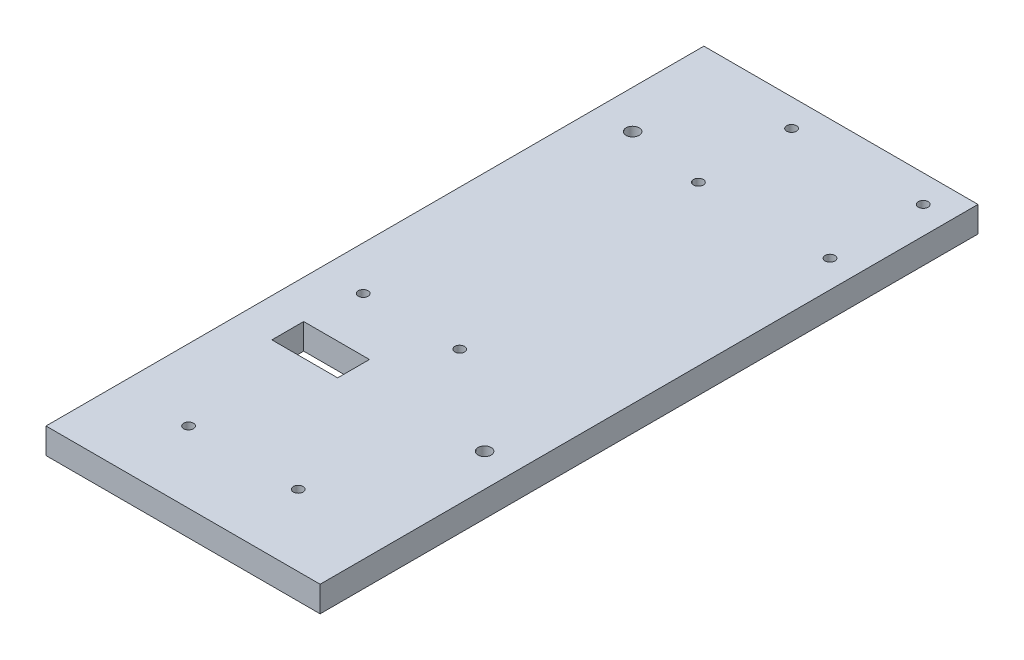
ISO-10303-21;
HEADER;
FILE_DESCRIPTION(('STEP AP214'),'2;1');
FILE_NAME('part.step','',(''),(''),'','','');
FILE_SCHEMA(('AUTOMOTIVE_DESIGN { 1 0 10303 214 1 1 1 1 }'));
ENDSEC;
DATA;
#1=APPLICATION_CONTEXT('core data for automotive mechanical design processes');
#2=APPLICATION_PROTOCOL_DEFINITION('international standard','automotive_design',2000,#1);
#3=PRODUCT_CONTEXT('',#1,'mechanical');
#4=PRODUCT('Part','Part','',(#3));
#5=PRODUCT_RELATED_PRODUCT_CATEGORY('part','',(#4));
#6=PRODUCT_DEFINITION_FORMATION('','',#4);
#7=PRODUCT_DEFINITION_CONTEXT('part definition',#1,'design');
#8=PRODUCT_DEFINITION('design','',#6,#7);
#9=PRODUCT_DEFINITION_SHAPE('','',#8);
#10=(LENGTH_UNIT() NAMED_UNIT(*) SI_UNIT(.MILLI.,.METRE.));
#11=(NAMED_UNIT(*) PLANE_ANGLE_UNIT() SI_UNIT($,.RADIAN.));
#12=(NAMED_UNIT(*) SI_UNIT($,.STERADIAN.) SOLID_ANGLE_UNIT());
#13=UNCERTAINTY_MEASURE_WITH_UNIT(LENGTH_MEASURE(1.E-05),#10,'distance_accuracy_value','');
#14=(GEOMETRIC_REPRESENTATION_CONTEXT(3) GLOBAL_UNCERTAINTY_ASSIGNED_CONTEXT((#13)) GLOBAL_UNIT_ASSIGNED_CONTEXT((#10,
#11,#12)) REPRESENTATION_CONTEXT('',''));
#15=CARTESIAN_POINT('',(0.,0.,0.));
#16=DIRECTION('',(0.,0.,1.));
#17=DIRECTION('',(1.,0.,0.));
#18=AXIS2_PLACEMENT_3D('',#15,#16,#17);
#19=CARTESIAN_POINT('',(0.,5.9436,0.));
#20=DIRECTION('',(1.,0.,0.));
#21=DIRECTION('',(0.,0.,-1.));
#22=AXIS2_PLACEMENT_3D('',#19,#20,#21);
#23=PLANE('',#22);
#24=DIRECTION('',(0.,0.,1.));
#25=VECTOR('',#24,1.);
#26=CARTESIAN_POINT('',(0.,0.,0.));
#27=LINE('',#26,#25);
#28=CARTESIAN_POINT('',(0.,0.,-152.4));
#29=VERTEX_POINT('',#28);
#30=CARTESIAN_POINT('',(0.,0.,0.));
#31=VERTEX_POINT('',#30);
#32=EDGE_CURVE('E149',#29,#31,#27,.T.);
#33=ORIENTED_EDGE('',*,*,#32,.T.);
#34=DIRECTION('',(0.,-1.,0.));
#35=VECTOR('',#34,1.);
#36=CARTESIAN_POINT('',(0.,5.9436,0.));
#37=LINE('',#36,#35);
#38=CARTESIAN_POINT('',(0.,5.9436,0.));
#39=VERTEX_POINT('',#38);
#40=EDGE_CURVE('E11',#39,#31,#37,.T.);
#41=ORIENTED_EDGE('',*,*,#40,.F.);
#42=DIRECTION('',(0.,0.,1.));
#43=VECTOR('',#42,1.);
#44=CARTESIAN_POINT('',(0.,5.9436,0.));
#45=LINE('',#44,#43);
#46=CARTESIAN_POINT('',(0.,5.9436,-152.4));
#47=VERTEX_POINT('',#46);
#48=EDGE_CURVE('E155',#47,#39,#45,.T.);
#49=ORIENTED_EDGE('',*,*,#48,.F.);
#50=DIRECTION('',(0.,-1.,0.));
#51=VECTOR('',#50,1.);
#52=CARTESIAN_POINT('',(0.,5.9436,-152.4));
#53=LINE('',#52,#51);
#54=EDGE_CURVE('E169',#47,#29,#53,.T.);
#55=ORIENTED_EDGE('',*,*,#54,.T.);
#56=EDGE_LOOP('',(#33,#41,#49,#55));
#57=FACE_BOUND('',#56,.T.);
#58=ADVANCED_FACE('F38',(#57),#23,.F.);
#59=CARTESIAN_POINT('',(0.,5.9436,0.));
#60=DIRECTION('',(0.,0.,-1.));
#61=DIRECTION('',(-1.,0.,0.));
#62=AXIS2_PLACEMENT_3D('',#59,#60,#61);
#63=PLANE('',#62);
#64=DIRECTION('',(1.,0.,0.));
#65=VECTOR('',#64,1.);
#66=CARTESIAN_POINT('',(0.,0.,0.));
#67=LINE('',#66,#65);
#68=CARTESIAN_POINT('',(63.5,0.,0.));
#69=VERTEX_POINT('',#68);
#70=EDGE_CURVE('E173',#31,#69,#67,.T.);
#71=ORIENTED_EDGE('',*,*,#70,.T.);
#72=DIRECTION('',(0.,-1.,0.));
#73=VECTOR('',#72,1.);
#74=CARTESIAN_POINT('',(63.5,5.9436,0.));
#75=LINE('',#74,#73);
#76=CARTESIAN_POINT('',(63.5,5.9436,0.));
#77=VERTEX_POINT('',#76);
#78=EDGE_CURVE('E46',#77,#69,#75,.T.);
#79=ORIENTED_EDGE('',*,*,#78,.F.);
#80=DIRECTION('',(1.,0.,0.));
#81=VECTOR('',#80,1.);
#82=CARTESIAN_POINT('',(0.,5.9436,0.));
#83=LINE('',#82,#81);
#84=EDGE_CURVE('E159',#39,#77,#83,.T.);
#85=ORIENTED_EDGE('',*,*,#84,.F.);
#86=ORIENTED_EDGE('',*,*,#40,.T.);
#87=EDGE_LOOP('',(#71,#79,#85,#86));
#88=FACE_BOUND('',#87,.T.);
#89=ADVANCED_FACE('F207',(#88),#63,.F.);
#90=CARTESIAN_POINT('',(63.5,5.9436,0.));
#91=DIRECTION('',(-1.,0.,0.));
#92=DIRECTION('',(0.,0.,1.));
#93=AXIS2_PLACEMENT_3D('',#90,#91,#92);
#94=PLANE('',#93);
#95=DIRECTION('',(0.,0.,-1.));
#96=VECTOR('',#95,1.);
#97=CARTESIAN_POINT('',(63.5,0.,0.));
#98=LINE('',#97,#96);
#99=CARTESIAN_POINT('',(63.5,0.,-152.4));
#100=VERTEX_POINT('',#99);
#101=EDGE_CURVE('E176',#69,#100,#98,.T.);
#102=ORIENTED_EDGE('',*,*,#101,.T.);
#103=DIRECTION('',(0.,-1.,0.));
#104=VECTOR('',#103,1.);
#105=CARTESIAN_POINT('',(63.5,5.9436,-152.4));
#106=LINE('',#105,#104);
#107=CARTESIAN_POINT('',(63.5,5.9436,-152.4));
#108=VERTEX_POINT('',#107);
#109=EDGE_CURVE('E184',#108,#100,#106,.T.);
#110=ORIENTED_EDGE('',*,*,#109,.F.);
#111=DIRECTION('',(0.,0.,-1.));
#112=VECTOR('',#111,1.);
#113=CARTESIAN_POINT('',(63.5,5.9436,0.));
#114=LINE('',#113,#112);
#115=EDGE_CURVE('E163',#77,#108,#114,.T.);
#116=ORIENTED_EDGE('',*,*,#115,.F.);
#117=ORIENTED_EDGE('',*,*,#78,.T.);
#118=EDGE_LOOP('',(#102,#110,#116,#117));
#119=FACE_BOUND('',#118,.T.);
#120=ADVANCED_FACE('F193',(#119),#94,.F.);
#121=CARTESIAN_POINT('',(0.,5.9436,-152.4));
#122=DIRECTION('',(0.,0.,1.));
#123=DIRECTION('',(1.,0.,0.));
#124=AXIS2_PLACEMENT_3D('',#121,#122,#123);
#125=PLANE('',#124);
#126=DIRECTION('',(-1.,0.,0.));
#127=VECTOR('',#126,1.);
#128=CARTESIAN_POINT('',(0.,0.,-152.4));
#129=LINE('',#128,#127);
#130=EDGE_CURVE('E160',#100,#29,#129,.T.);
#131=ORIENTED_EDGE('',*,*,#130,.T.);
#132=ORIENTED_EDGE('',*,*,#54,.F.);
#133=DIRECTION('',(-1.,0.,0.));
#134=VECTOR('',#133,1.);
#135=CARTESIAN_POINT('',(0.,5.9436,-152.4));
#136=LINE('',#135,#134);
#137=EDGE_CURVE('E166',#108,#47,#136,.T.);
#138=ORIENTED_EDGE('',*,*,#137,.F.);
#139=ORIENTED_EDGE('',*,*,#109,.T.);
#140=EDGE_LOOP('',(#131,#132,#138,#139));
#141=FACE_BOUND('',#140,.T.);
#142=ADVANCED_FACE('F200',(#141),#125,.F.);
#143=CARTESIAN_POINT('',(0.,5.9436,0.));
#144=DIRECTION('',(0.,-1.,0.));
#145=DIRECTION('',(0.,0.,-1.));
#146=AXIS2_PLACEMENT_3D('',#143,#144,#145);
#147=PLANE('',#146);
#148=CARTESIAN_POINT('',(8.88999999999999,5.9436,-127.));
#149=DIRECTION('',(0.,1.,0.));
#150=DIRECTION('',(0.,0.,1.));
#151=AXIS2_PLACEMENT_3D('',#148,#149,#150);
#152=CIRCLE('',#151,1.524);
#153=CARTESIAN_POINT('',(8.88999999999999,5.9436,-125.476));
#154=VERTEX_POINT('',#153);
#155=EDGE_CURVE('E281',#154,#154,#152,.T.);
#156=ORIENTED_EDGE('',*,*,#155,.F.);
#157=EDGE_LOOP('',(#156));
#158=FACE_BOUND('',#157,.T.);
#159=CARTESIAN_POINT('',(55.88,5.9436,-45.72));
#160=DIRECTION('',(0.,1.,0.));
#161=DIRECTION('',(0.,0.,1.));
#162=AXIS2_PLACEMENT_3D('',#159,#160,#161);
#163=CIRCLE('',#162,1.524);
#164=CARTESIAN_POINT('',(55.88,5.9436,-44.196));
#165=VERTEX_POINT('',#164);
#166=EDGE_CURVE('E290',#165,#165,#163,.T.);
#167=ORIENTED_EDGE('',*,*,#166,.F.);
#168=EDGE_LOOP('',(#167));
#169=FACE_BOUND('',#168,.T.);
#170=CARTESIAN_POINT('',(41.91,5.9436,-16.51));
#171=DIRECTION('',(0.,1.,0.));
#172=DIRECTION('',(0.,0.,1.));
#173=AXIS2_PLACEMENT_3D('',#170,#171,#172);
#174=CIRCLE('',#173,1.13029999999999);
#175=CARTESIAN_POINT('',(41.91,5.9436,-15.3797));
#176=VERTEX_POINT('',#175);
#177=EDGE_CURVE('E287',#176,#176,#174,.T.);
#178=ORIENTED_EDGE('',*,*,#177,.F.);
#179=EDGE_LOOP('',(#178));
#180=FACE_BOUND('',#179,.T.);
#181=CARTESIAN_POINT('',(16.51,5.9436,-16.51));
#182=DIRECTION('',(0.,1.,0.));
#183=DIRECTION('',(0.,0.,1.));
#184=AXIS2_PLACEMENT_3D('',#181,#182,#183);
#185=CIRCLE('',#184,1.13029999999999);
#186=CARTESIAN_POINT('',(16.51,5.9436,-15.3797));
#187=VERTEX_POINT('',#186);
#188=EDGE_CURVE('E303',#187,#187,#185,.T.);
#189=ORIENTED_EDGE('',*,*,#188,.F.);
#190=EDGE_LOOP('',(#189));
#191=FACE_BOUND('',#190,.T.);
#192=CARTESIAN_POINT('',(32.512,5.9436,-63.3222));
#193=DIRECTION('',(0.,1.,0.));
#194=DIRECTION('',(0.,0.,1.));
#195=AXIS2_PLACEMENT_3D('',#192,#193,#194);
#196=CIRCLE('',#195,1.13029999999999);
#197=CARTESIAN_POINT('',(32.512,5.9436,-62.1919));
#198=VERTEX_POINT('',#197);
#199=EDGE_CURVE('E311',#198,#198,#196,.T.);
#200=ORIENTED_EDGE('',*,*,#199,.F.);
#201=EDGE_LOOP('',(#200));
#202=FACE_BOUND('',#201,.T.);
#203=CARTESIAN_POINT('',(10.16,5.9436,-63.3222));
#204=DIRECTION('',(0.,1.,0.));
#205=DIRECTION('',(0.,0.,1.));
#206=AXIS2_PLACEMENT_3D('',#203,#204,#205);
#207=CIRCLE('',#206,1.13029999999999);
#208=CARTESIAN_POINT('',(10.16,5.9436,-62.1919));
#209=VERTEX_POINT('',#208);
#210=EDGE_CURVE('E319',#209,#209,#207,.T.);
#211=ORIENTED_EDGE('',*,*,#210,.F.);
#212=EDGE_LOOP('',(#211));
#213=FACE_BOUND('',#212,.T.);
#214=CARTESIAN_POINT('',(57.15,5.9436,-146.05));
#215=DIRECTION('',(0.,1.,0.));
#216=DIRECTION('',(0.,0.,1.));
#217=AXIS2_PLACEMENT_3D('',#214,#215,#216);
#218=CIRCLE('',#217,1.13029999999999);
#219=CARTESIAN_POINT('',(57.15,5.9436,-144.9197));
#220=VERTEX_POINT('',#219);
#221=EDGE_CURVE('E327',#220,#220,#218,.T.);
#222=ORIENTED_EDGE('',*,*,#221,.F.);
#223=EDGE_LOOP('',(#222));
#224=FACE_BOUND('',#223,.T.);
#225=CARTESIAN_POINT('',(57.15,5.9436,-124.46));
#226=DIRECTION('',(0.,1.,0.));
#227=DIRECTION('',(0.,0.,1.));
#228=AXIS2_PLACEMENT_3D('',#225,#226,#227);
#229=CIRCLE('',#228,1.13029999999999);
#230=CARTESIAN_POINT('',(57.15,5.9436,-123.3297));
#231=VERTEX_POINT('',#230);
#232=EDGE_CURVE('E335',#231,#231,#229,.T.);
#233=ORIENTED_EDGE('',*,*,#232,.F.);
#234=EDGE_LOOP('',(#233));
#235=FACE_BOUND('',#234,.T.);
#236=CARTESIAN_POINT('',(26.67,5.9436,-124.46));
#237=DIRECTION('',(0.,1.,0.));
#238=DIRECTION('',(0.,0.,1.));
#239=AXIS2_PLACEMENT_3D('',#236,#237,#238);
#240=CIRCLE('',#239,1.13029999999999);
#241=CARTESIAN_POINT('',(26.67,5.9436,-123.3297));
#242=VERTEX_POINT('',#241);
#243=EDGE_CURVE('E343',#242,#242,#240,.T.);
#244=ORIENTED_EDGE('',*,*,#243,.F.);
#245=EDGE_LOOP('',(#244));
#246=FACE_BOUND('',#245,.T.);
#247=CARTESIAN_POINT('',(26.67,5.9436,-146.05));
#248=DIRECTION('',(0.,1.,0.));
#249=DIRECTION('',(0.,0.,1.));
#250=AXIS2_PLACEMENT_3D('',#247,#248,#249);
#251=CIRCLE('',#250,1.13029999999999);
#252=CARTESIAN_POINT('',(26.67,5.9436,-144.9197));
#253=VERTEX_POINT('',#252);
#254=EDGE_CURVE('E350',#253,#253,#251,.T.);
#255=ORIENTED_EDGE('',*,*,#254,.F.);
#256=EDGE_LOOP('',(#255));
#257=FACE_BOUND('',#256,.T.);
#258=DIRECTION('',(-1.,0.,0.));
#259=VECTOR('',#258,1.);
#260=CARTESIAN_POINT('',(8.89,5.9436,-50.8));
#261=LINE('',#260,#259);
#262=CARTESIAN_POINT('',(24.13,5.9436,-50.8));
#263=VERTEX_POINT('',#262);
#264=CARTESIAN_POINT('',(8.89,5.9436,-50.8));
#265=VERTEX_POINT('',#264);
#266=EDGE_CURVE('E140',#263,#265,#261,.T.);
#267=ORIENTED_EDGE('',*,*,#266,.F.);
#268=DIRECTION('',(0.,0.,-1.));
#269=VECTOR('',#268,1.);
#270=CARTESIAN_POINT('',(24.13,5.9436,-50.8));
#271=LINE('',#270,#269);
#272=CARTESIAN_POINT('',(24.13,5.9436,-43.434));
#273=VERTEX_POINT('',#272);
#274=EDGE_CURVE('E53',#273,#263,#271,.T.);
#275=ORIENTED_EDGE('',*,*,#274,.F.);
#276=DIRECTION('',(1.,0.,0.));
#277=VECTOR('',#276,1.);
#278=CARTESIAN_POINT('',(8.89,5.9436,-43.434));
#279=LINE('',#278,#277);
#280=CARTESIAN_POINT('',(8.89,5.9436,-43.434));
#281=VERTEX_POINT('',#280);
#282=EDGE_CURVE('E124',#281,#273,#279,.T.);
#283=ORIENTED_EDGE('',*,*,#282,.F.);
#284=DIRECTION('',(0.,0.,1.));
#285=VECTOR('',#284,1.);
#286=CARTESIAN_POINT('',(8.89,5.9436,-50.8));
#287=LINE('',#286,#285);
#288=EDGE_CURVE('E128',#265,#281,#287,.T.);
#289=ORIENTED_EDGE('',*,*,#288,.F.);
#290=EDGE_LOOP('',(#267,#275,#283,#289));
#291=FACE_BOUND('',#290,.T.);
#292=ORIENTED_EDGE('',*,*,#48,.T.);
#293=ORIENTED_EDGE('',*,*,#84,.T.);
#294=ORIENTED_EDGE('',*,*,#115,.T.);
#295=ORIENTED_EDGE('',*,*,#137,.T.);
#296=EDGE_LOOP('',(#292,#293,#294,#295));
#297=FACE_BOUND('',#296,.T.);
#298=ADVANCED_FACE('F206',(#158,#169,#180,#191,#202,#213,#224,#235,#246,#257,#291,#297),#147,.F.);
#299=CARTESIAN_POINT('',(0.,0.,0.));
#300=DIRECTION('',(0.,-1.,0.));
#301=DIRECTION('',(0.,0.,-1.));
#302=AXIS2_PLACEMENT_3D('',#299,#300,#301);
#303=PLANE('',#302);
#304=CARTESIAN_POINT('',(8.88999999999999,0.,-127.));
#305=DIRECTION('',(0.,1.,0.));
#306=DIRECTION('',(0.,0.,1.));
#307=AXIS2_PLACEMENT_3D('',#304,#305,#306);
#308=CIRCLE('',#307,1.524);
#309=CARTESIAN_POINT('',(8.88999999999999,0.,-125.476));
#310=VERTEX_POINT('',#309);
#311=EDGE_CURVE('E278',#310,#310,#308,.T.);
#312=ORIENTED_EDGE('',*,*,#311,.T.);
#313=EDGE_LOOP('',(#312));
#314=FACE_BOUND('',#313,.T.);
#315=CARTESIAN_POINT('',(55.88,0.,-45.72));
#316=DIRECTION('',(0.,1.,0.));
#317=DIRECTION('',(0.,0.,1.));
#318=AXIS2_PLACEMENT_3D('',#315,#316,#317);
#319=CIRCLE('',#318,1.524);
#320=CARTESIAN_POINT('',(55.88,0.,-44.196));
#321=VERTEX_POINT('',#320);
#322=EDGE_CURVE('E283',#321,#321,#319,.T.);
#323=ORIENTED_EDGE('',*,*,#322,.T.);
#324=EDGE_LOOP('',(#323));
#325=FACE_BOUND('',#324,.T.);
#326=CARTESIAN_POINT('',(41.91,0.,-16.51));
#327=DIRECTION('',(0.,1.,0.));
#328=DIRECTION('',(0.,0.,1.));
#329=AXIS2_PLACEMENT_3D('',#326,#327,#328);
#330=CIRCLE('',#329,1.1303);
#331=CARTESIAN_POINT('',(41.91,0.,-15.3797));
#332=VERTEX_POINT('',#331);
#333=EDGE_CURVE('E299',#332,#332,#330,.T.);
#334=ORIENTED_EDGE('',*,*,#333,.T.);
#335=EDGE_LOOP('',(#334));
#336=FACE_BOUND('',#335,.T.);
#337=CARTESIAN_POINT('',(16.51,0.,-16.51));
#338=DIRECTION('',(0.,1.,0.));
#339=DIRECTION('',(0.,0.,1.));
#340=AXIS2_PLACEMENT_3D('',#337,#338,#339);
#341=CIRCLE('',#340,1.1303);
#342=CARTESIAN_POINT('',(16.51,0.,-15.3797));
#343=VERTEX_POINT('',#342);
#344=EDGE_CURVE('E307',#343,#343,#341,.T.);
#345=ORIENTED_EDGE('',*,*,#344,.T.);
#346=EDGE_LOOP('',(#345));
#347=FACE_BOUND('',#346,.T.);
#348=CARTESIAN_POINT('',(32.512,0.,-63.3222));
#349=DIRECTION('',(0.,1.,0.));
#350=DIRECTION('',(0.,0.,1.));
#351=AXIS2_PLACEMENT_3D('',#348,#349,#350);
#352=CIRCLE('',#351,1.1303);
#353=CARTESIAN_POINT('',(32.512,0.,-62.1919));
#354=VERTEX_POINT('',#353);
#355=EDGE_CURVE('E315',#354,#354,#352,.T.);
#356=ORIENTED_EDGE('',*,*,#355,.T.);
#357=EDGE_LOOP('',(#356));
#358=FACE_BOUND('',#357,.T.);
#359=CARTESIAN_POINT('',(10.16,0.,-63.3222));
#360=DIRECTION('',(0.,1.,0.));
#361=DIRECTION('',(0.,0.,1.));
#362=AXIS2_PLACEMENT_3D('',#359,#360,#361);
#363=CIRCLE('',#362,1.1303);
#364=CARTESIAN_POINT('',(10.16,0.,-62.1919));
#365=VERTEX_POINT('',#364);
#366=EDGE_CURVE('E323',#365,#365,#363,.T.);
#367=ORIENTED_EDGE('',*,*,#366,.T.);
#368=EDGE_LOOP('',(#367));
#369=FACE_BOUND('',#368,.T.);
#370=CARTESIAN_POINT('',(57.15,0.,-146.05));
#371=DIRECTION('',(0.,1.,0.));
#372=DIRECTION('',(0.,0.,1.));
#373=AXIS2_PLACEMENT_3D('',#370,#371,#372);
#374=CIRCLE('',#373,1.1303);
#375=CARTESIAN_POINT('',(57.15,0.,-144.9197));
#376=VERTEX_POINT('',#375);
#377=EDGE_CURVE('E331',#376,#376,#374,.T.);
#378=ORIENTED_EDGE('',*,*,#377,.T.);
#379=EDGE_LOOP('',(#378));
#380=FACE_BOUND('',#379,.T.);
#381=CARTESIAN_POINT('',(57.15,0.,-124.46));
#382=DIRECTION('',(0.,1.,0.));
#383=DIRECTION('',(0.,0.,1.));
#384=AXIS2_PLACEMENT_3D('',#381,#382,#383);
#385=CIRCLE('',#384,1.1303);
#386=CARTESIAN_POINT('',(57.15,0.,-123.3297));
#387=VERTEX_POINT('',#386);
#388=EDGE_CURVE('E339',#387,#387,#385,.T.);
#389=ORIENTED_EDGE('',*,*,#388,.T.);
#390=EDGE_LOOP('',(#389));
#391=FACE_BOUND('',#390,.T.);
#392=CARTESIAN_POINT('',(26.67,0.,-124.46));
#393=DIRECTION('',(0.,1.,0.));
#394=DIRECTION('',(0.,0.,1.));
#395=AXIS2_PLACEMENT_3D('',#392,#393,#394);
#396=CIRCLE('',#395,1.1303);
#397=CARTESIAN_POINT('',(26.67,0.,-123.3297));
#398=VERTEX_POINT('',#397);
#399=EDGE_CURVE('E347',#398,#398,#396,.T.);
#400=ORIENTED_EDGE('',*,*,#399,.T.);
#401=EDGE_LOOP('',(#400));
#402=FACE_BOUND('',#401,.T.);
#403=CARTESIAN_POINT('',(26.67,0.,-146.05));
#404=DIRECTION('',(0.,1.,0.));
#405=DIRECTION('',(0.,0.,1.));
#406=AXIS2_PLACEMENT_3D('',#403,#404,#405);
#407=CIRCLE('',#406,1.1303);
#408=CARTESIAN_POINT('',(26.67,0.,-144.9197));
#409=VERTEX_POINT('',#408);
#410=EDGE_CURVE('E131',#409,#409,#407,.T.);
#411=ORIENTED_EDGE('',*,*,#410,.T.);
#412=EDGE_LOOP('',(#411));
#413=FACE_BOUND('',#412,.T.);
#414=DIRECTION('',(0.,0.,-1.));
#415=VECTOR('',#414,1.);
#416=CARTESIAN_POINT('',(24.13,0.,-50.8));
#417=LINE('',#416,#415);
#418=CARTESIAN_POINT('',(24.13,0.,-43.434));
#419=VERTEX_POINT('',#418);
#420=CARTESIAN_POINT('',(24.13,0.,-50.8));
#421=VERTEX_POINT('',#420);
#422=EDGE_CURVE('E105',#419,#421,#417,.T.);
#423=ORIENTED_EDGE('',*,*,#422,.T.);
#424=DIRECTION('',(-1.,0.,0.));
#425=VECTOR('',#424,1.);
#426=CARTESIAN_POINT('',(8.89,0.,-50.8));
#427=LINE('',#426,#425);
#428=CARTESIAN_POINT('',(8.89,0.,-50.8));
#429=VERTEX_POINT('',#428);
#430=EDGE_CURVE('E115',#421,#429,#427,.T.);
#431=ORIENTED_EDGE('',*,*,#430,.T.);
#432=DIRECTION('',(0.,0.,1.));
#433=VECTOR('',#432,1.);
#434=CARTESIAN_POINT('',(8.89,0.,-50.8));
#435=LINE('',#434,#433);
#436=CARTESIAN_POINT('',(8.89,0.,-43.434));
#437=VERTEX_POINT('',#436);
#438=EDGE_CURVE('E61',#429,#437,#435,.T.);
#439=ORIENTED_EDGE('',*,*,#438,.T.);
#440=DIRECTION('',(1.,0.,0.));
#441=VECTOR('',#440,1.);
#442=CARTESIAN_POINT('',(8.89,0.,-43.434));
#443=LINE('',#442,#441);
#444=EDGE_CURVE('E112',#437,#419,#443,.T.);
#445=ORIENTED_EDGE('',*,*,#444,.T.);
#446=EDGE_LOOP('',(#423,#431,#439,#445));
#447=FACE_BOUND('',#446,.T.);
#448=ORIENTED_EDGE('',*,*,#32,.F.);
#449=ORIENTED_EDGE('',*,*,#130,.F.);
#450=ORIENTED_EDGE('',*,*,#101,.F.);
#451=ORIENTED_EDGE('',*,*,#70,.F.);
#452=EDGE_LOOP('',(#448,#449,#450,#451));
#453=FACE_BOUND('',#452,.T.);
#454=ADVANCED_FACE('F120',(#314,#325,#336,#347,#358,#369,#380,#391,#402,#413,#447,#453),#303,.T.);
#455=CARTESIAN_POINT('',(24.13,0.,-50.8));
#456=DIRECTION('',(1.,0.,0.));
#457=DIRECTION('',(0.,0.,-1.));
#458=AXIS2_PLACEMENT_3D('',#455,#456,#457);
#459=PLANE('',#458);
#460=ORIENTED_EDGE('',*,*,#274,.T.);
#461=DIRECTION('',(0.,1.,0.));
#462=VECTOR('',#461,1.);
#463=CARTESIAN_POINT('',(24.13,0.,-50.8));
#464=LINE('',#463,#462);
#465=EDGE_CURVE('E101',#421,#263,#464,.T.);
#466=ORIENTED_EDGE('',*,*,#465,.F.);
#467=ORIENTED_EDGE('',*,*,#422,.F.);
#468=DIRECTION('',(0.,1.,0.));
#469=VECTOR('',#468,1.);
#470=CARTESIAN_POINT('',(24.13,0.,-43.434));
#471=LINE('',#470,#469);
#472=EDGE_CURVE('E146',#419,#273,#471,.T.);
#473=ORIENTED_EDGE('',*,*,#472,.T.);
#474=EDGE_LOOP('',(#460,#466,#467,#473));
#475=FACE_BOUND('',#474,.T.);
#476=ADVANCED_FACE('F103',(#475),#459,.F.);
#477=CARTESIAN_POINT('',(8.89,0.,-43.434));
#478=DIRECTION('',(0.,0.,1.));
#479=DIRECTION('',(1.,0.,0.));
#480=AXIS2_PLACEMENT_3D('',#477,#478,#479);
#481=PLANE('',#480);
#482=ORIENTED_EDGE('',*,*,#282,.T.);
#483=ORIENTED_EDGE('',*,*,#472,.F.);
#484=ORIENTED_EDGE('',*,*,#444,.F.);
#485=DIRECTION('',(0.,1.,0.));
#486=VECTOR('',#485,1.);
#487=CARTESIAN_POINT('',(8.89,0.,-43.434));
#488=LINE('',#487,#486);
#489=EDGE_CURVE('E150',#437,#281,#488,.T.);
#490=ORIENTED_EDGE('',*,*,#489,.T.);
#491=EDGE_LOOP('',(#482,#483,#484,#490));
#492=FACE_BOUND('',#491,.T.);
#493=ADVANCED_FACE('F225',(#492),#481,.F.);
#494=CARTESIAN_POINT('',(8.89,0.,-50.8));
#495=DIRECTION('',(-1.,0.,0.));
#496=DIRECTION('',(0.,0.,1.));
#497=AXIS2_PLACEMENT_3D('',#494,#495,#496);
#498=PLANE('',#497);
#499=ORIENTED_EDGE('',*,*,#288,.T.);
#500=ORIENTED_EDGE('',*,*,#489,.F.);
#501=ORIENTED_EDGE('',*,*,#438,.F.);
#502=DIRECTION('',(0.,1.,0.));
#503=VECTOR('',#502,1.);
#504=CARTESIAN_POINT('',(8.89,0.,-50.8));
#505=LINE('',#504,#503);
#506=EDGE_CURVE('E111',#429,#265,#505,.T.);
#507=ORIENTED_EDGE('',*,*,#506,.T.);
#508=EDGE_LOOP('',(#499,#500,#501,#507));
#509=FACE_BOUND('',#508,.T.);
#510=ADVANCED_FACE('F229',(#509),#498,.F.);
#511=CARTESIAN_POINT('',(8.89,0.,-50.8));
#512=DIRECTION('',(0.,0.,-1.));
#513=DIRECTION('',(-1.,0.,0.));
#514=AXIS2_PLACEMENT_3D('',#511,#512,#513);
#515=PLANE('',#514);
#516=ORIENTED_EDGE('',*,*,#266,.T.);
#517=ORIENTED_EDGE('',*,*,#506,.F.);
#518=ORIENTED_EDGE('',*,*,#430,.F.);
#519=ORIENTED_EDGE('',*,*,#465,.T.);
#520=EDGE_LOOP('',(#516,#517,#518,#519));
#521=FACE_BOUND('',#520,.T.);
#522=ADVANCED_FACE('F116',(#521),#515,.F.);
#523=CARTESIAN_POINT('',(26.67,5.9436,-146.05));
#524=DIRECTION('',(0.,1.,0.));
#525=DIRECTION('',(0.,0.,1.));
#526=AXIS2_PLACEMENT_3D('',#523,#524,#525);
#527=CYLINDRICAL_SURFACE('',#526,1.13029999999999);
#528=ORIENTED_EDGE('',*,*,#410,.F.);
#529=EDGE_LOOP('',(#528));
#530=FACE_BOUND('',#529,.T.);
#531=ORIENTED_EDGE('',*,*,#254,.T.);
#532=EDGE_LOOP('',(#531));
#533=FACE_BOUND('',#532,.T.);
#534=ADVANCED_FACE('F228',(#530,#533),#527,.F.);
#535=CARTESIAN_POINT('',(26.67,5.9436,-124.46));
#536=DIRECTION('',(0.,1.,0.));
#537=DIRECTION('',(0.,0.,1.));
#538=AXIS2_PLACEMENT_3D('',#535,#536,#537);
#539=CYLINDRICAL_SURFACE('',#538,1.13029999999999);
#540=ORIENTED_EDGE('',*,*,#399,.F.);
#541=EDGE_LOOP('',(#540));
#542=FACE_BOUND('',#541,.T.);
#543=ORIENTED_EDGE('',*,*,#243,.T.);
#544=EDGE_LOOP('',(#543));
#545=FACE_BOUND('',#544,.T.);
#546=ADVANCED_FACE('F237',(#542,#545),#539,.F.);
#547=CARTESIAN_POINT('',(57.15,5.9436,-124.46));
#548=DIRECTION('',(0.,1.,0.));
#549=DIRECTION('',(0.,0.,1.));
#550=AXIS2_PLACEMENT_3D('',#547,#548,#549);
#551=CYLINDRICAL_SURFACE('',#550,1.13029999999999);
#552=ORIENTED_EDGE('',*,*,#388,.F.);
#553=EDGE_LOOP('',(#552));
#554=FACE_BOUND('',#553,.T.);
#555=ORIENTED_EDGE('',*,*,#232,.T.);
#556=EDGE_LOOP('',(#555));
#557=FACE_BOUND('',#556,.T.);
#558=ADVANCED_FACE('F241',(#554,#557),#551,.F.);
#559=CARTESIAN_POINT('',(57.15,5.9436,-146.05));
#560=DIRECTION('',(0.,1.,0.));
#561=DIRECTION('',(0.,0.,1.));
#562=AXIS2_PLACEMENT_3D('',#559,#560,#561);
#563=CYLINDRICAL_SURFACE('',#562,1.13029999999999);
#564=ORIENTED_EDGE('',*,*,#377,.F.);
#565=EDGE_LOOP('',(#564));
#566=FACE_BOUND('',#565,.T.);
#567=ORIENTED_EDGE('',*,*,#221,.T.);
#568=EDGE_LOOP('',(#567));
#569=FACE_BOUND('',#568,.T.);
#570=ADVANCED_FACE('F245',(#566,#569),#563,.F.);
#571=CARTESIAN_POINT('',(10.16,5.9436,-63.3222));
#572=DIRECTION('',(0.,1.,0.));
#573=DIRECTION('',(0.,0.,1.));
#574=AXIS2_PLACEMENT_3D('',#571,#572,#573);
#575=CYLINDRICAL_SURFACE('',#574,1.13029999999999);
#576=ORIENTED_EDGE('',*,*,#366,.F.);
#577=EDGE_LOOP('',(#576));
#578=FACE_BOUND('',#577,.T.);
#579=ORIENTED_EDGE('',*,*,#210,.T.);
#580=EDGE_LOOP('',(#579));
#581=FACE_BOUND('',#580,.T.);
#582=ADVANCED_FACE('F249',(#578,#581),#575,.F.);
#583=CARTESIAN_POINT('',(32.512,5.9436,-63.3222));
#584=DIRECTION('',(0.,1.,0.));
#585=DIRECTION('',(0.,0.,1.));
#586=AXIS2_PLACEMENT_3D('',#583,#584,#585);
#587=CYLINDRICAL_SURFACE('',#586,1.13029999999999);
#588=ORIENTED_EDGE('',*,*,#355,.F.);
#589=EDGE_LOOP('',(#588));
#590=FACE_BOUND('',#589,.T.);
#591=ORIENTED_EDGE('',*,*,#199,.T.);
#592=EDGE_LOOP('',(#591));
#593=FACE_BOUND('',#592,.T.);
#594=ADVANCED_FACE('F253',(#590,#593),#587,.F.);
#595=CARTESIAN_POINT('',(16.51,5.9436,-16.51));
#596=DIRECTION('',(0.,1.,0.));
#597=DIRECTION('',(0.,0.,1.));
#598=AXIS2_PLACEMENT_3D('',#595,#596,#597);
#599=CYLINDRICAL_SURFACE('',#598,1.13029999999999);
#600=ORIENTED_EDGE('',*,*,#344,.F.);
#601=EDGE_LOOP('',(#600));
#602=FACE_BOUND('',#601,.T.);
#603=ORIENTED_EDGE('',*,*,#188,.T.);
#604=EDGE_LOOP('',(#603));
#605=FACE_BOUND('',#604,.T.);
#606=ADVANCED_FACE('F257',(#602,#605),#599,.F.);
#607=CARTESIAN_POINT('',(41.91,5.9436,-16.51));
#608=DIRECTION('',(0.,1.,0.));
#609=DIRECTION('',(0.,0.,1.));
#610=AXIS2_PLACEMENT_3D('',#607,#608,#609);
#611=CYLINDRICAL_SURFACE('',#610,1.13029999999999);
#612=ORIENTED_EDGE('',*,*,#333,.F.);
#613=EDGE_LOOP('',(#612));
#614=FACE_BOUND('',#613,.T.);
#615=ORIENTED_EDGE('',*,*,#177,.T.);
#616=EDGE_LOOP('',(#615));
#617=FACE_BOUND('',#616,.T.);
#618=ADVANCED_FACE('F261',(#614,#617),#611,.F.);
#619=CARTESIAN_POINT('',(55.88,0.,-45.72));
#620=DIRECTION('',(0.,1.,0.));
#621=DIRECTION('',(0.,0.,1.));
#622=AXIS2_PLACEMENT_3D('',#619,#620,#621);
#623=CYLINDRICAL_SURFACE('',#622,1.524);
#624=ORIENTED_EDGE('',*,*,#322,.F.);
#625=EDGE_LOOP('',(#624));
#626=FACE_BOUND('',#625,.T.);
#627=ORIENTED_EDGE('',*,*,#166,.T.);
#628=EDGE_LOOP('',(#627));
#629=FACE_BOUND('',#628,.T.);
#630=ADVANCED_FACE('F265',(#626,#629),#623,.F.);
#631=CARTESIAN_POINT('',(8.88999999999999,0.,-127.));
#632=DIRECTION('',(0.,1.,0.));
#633=DIRECTION('',(0.,0.,1.));
#634=AXIS2_PLACEMENT_3D('',#631,#632,#633);
#635=CYLINDRICAL_SURFACE('',#634,1.524);
#636=ORIENTED_EDGE('',*,*,#311,.F.);
#637=EDGE_LOOP('',(#636));
#638=FACE_BOUND('',#637,.T.);
#639=ORIENTED_EDGE('',*,*,#155,.T.);
#640=EDGE_LOOP('',(#639));
#641=FACE_BOUND('',#640,.T.);
#642=ADVANCED_FACE('F269',(#638,#641),#635,.F.);
#643=CLOSED_SHELL('',(#58,#89,#120,#142,#298,#454,#476,#493,#510,#522,#534,#546,#558,#570,#582,
#594,#606,#618,#630,#642));
#644=MANIFOLD_SOLID_BREP('B2',#643);
#645=ADVANCED_BREP_SHAPE_REPRESENTATION('',(#18,#644),#14);
#646=SHAPE_DEFINITION_REPRESENTATION(#9,#645);
ENDSEC;
END-ISO-10303-21;
